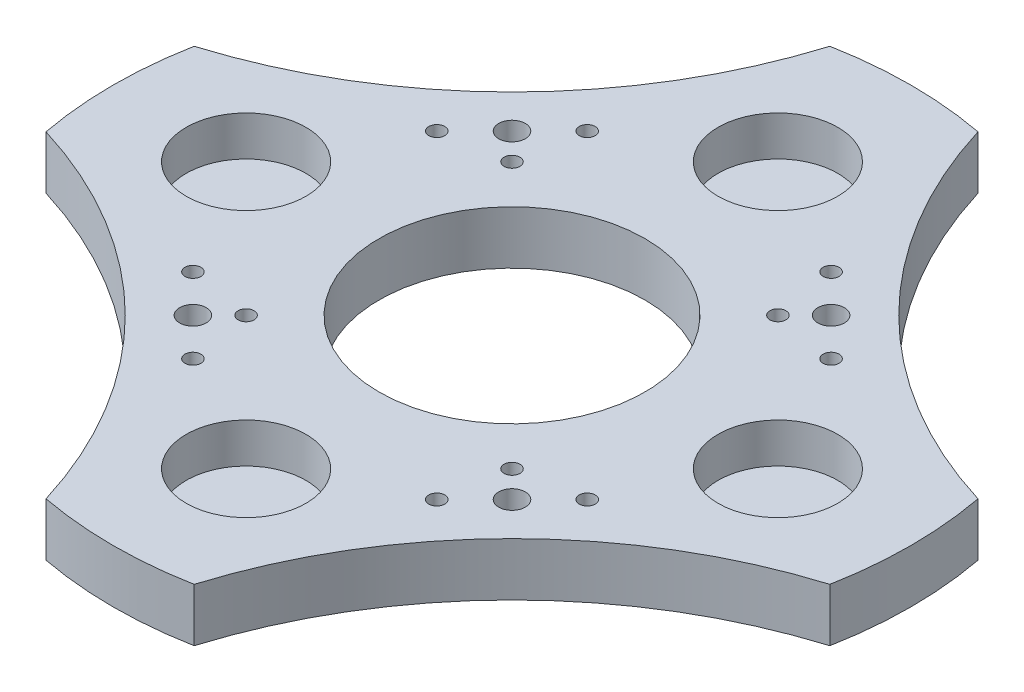
ISO-10303-21;
HEADER;
FILE_DESCRIPTION(('STEP AP214'),'2;1');
FILE_NAME('part.step','',(''),(''),'','','');
FILE_SCHEMA(('AUTOMOTIVE_DESIGN { 1 0 10303 214 1 1 1 1 }'));
ENDSEC;
DATA;
#1=APPLICATION_CONTEXT('core data for automotive mechanical design processes');
#2=APPLICATION_PROTOCOL_DEFINITION('international standard','automotive_design',2000,#1);
#3=PRODUCT_CONTEXT('',#1,'mechanical');
#4=PRODUCT('Part','Part','',(#3));
#5=PRODUCT_RELATED_PRODUCT_CATEGORY('part','',(#4));
#6=PRODUCT_DEFINITION_FORMATION('','',#4);
#7=PRODUCT_DEFINITION_CONTEXT('part definition',#1,'design');
#8=PRODUCT_DEFINITION('design','',#6,#7);
#9=PRODUCT_DEFINITION_SHAPE('','',#8);
#10=(LENGTH_UNIT() NAMED_UNIT(*) SI_UNIT(.MILLI.,.METRE.));
#11=(NAMED_UNIT(*) PLANE_ANGLE_UNIT() SI_UNIT($,.RADIAN.));
#12=(NAMED_UNIT(*) SI_UNIT($,.STERADIAN.) SOLID_ANGLE_UNIT());
#13=UNCERTAINTY_MEASURE_WITH_UNIT(LENGTH_MEASURE(1.E-05),#10,'distance_accuracy_value','');
#14=(GEOMETRIC_REPRESENTATION_CONTEXT(3) GLOBAL_UNCERTAINTY_ASSIGNED_CONTEXT((#13)) GLOBAL_UNIT_ASSIGNED_CONTEXT((#10,
#11,#12)) REPRESENTATION_CONTEXT('',''));
#15=CARTESIAN_POINT('',(0.,0.,0.));
#16=DIRECTION('',(0.,0.,1.));
#17=DIRECTION('',(1.,0.,0.));
#18=AXIS2_PLACEMENT_3D('',#15,#16,#17);
#19=CARTESIAN_POINT('',(0.,10.,0.));
#20=DIRECTION('',(0.,-1.,0.));
#21=DIRECTION('',(0.,0.,-1.));
#22=AXIS2_PLACEMENT_3D('',#19,#20,#21);
#23=CYLINDRICAL_SURFACE('',#22,75.);
#24=CARTESIAN_POINT('',(0.,0.,0.));
#25=DIRECTION('',(0.,1.,0.));
#26=DIRECTION('',(0.,0.,1.));
#27=AXIS2_PLACEMENT_3D('',#24,#25,#26);
#28=CIRCLE('',#27,75.);
#29=CARTESIAN_POINT('',(-73.6950173596536,0.,-13.9299826403464));
#30=VERTEX_POINT('',#29);
#31=CARTESIAN_POINT('',(-73.6950173596536,0.,13.9299826403464));
#32=VERTEX_POINT('',#31);
#33=EDGE_CURVE('E121',#30,#32,#28,.T.);
#34=ORIENTED_EDGE('',*,*,#33,.T.);
#35=DIRECTION('',(0.,1.,0.));
#36=VECTOR('',#35,1.);
#37=CARTESIAN_POINT('',(-73.6950173596536,5.,13.9299826403464));
#38=LINE('',#37,#36);
#39=CARTESIAN_POINT('',(-73.6950173596536,10.,13.9299826403464));
#40=VERTEX_POINT('',#39);
#41=EDGE_CURVE('E60',#32,#40,#38,.T.);
#42=ORIENTED_EDGE('',*,*,#41,.T.);
#43=CARTESIAN_POINT('',(0.,10.,0.));
#44=DIRECTION('',(0.,1.,0.));
#45=DIRECTION('',(0.,0.,1.));
#46=AXIS2_PLACEMENT_3D('',#43,#44,#45);
#47=CIRCLE('',#46,75.);
#48=CARTESIAN_POINT('',(-73.6950173596536,10.,-13.9299826403464));
#49=VERTEX_POINT('',#48);
#50=EDGE_CURVE('E123',#49,#40,#47,.T.);
#51=ORIENTED_EDGE('',*,*,#50,.F.);
#52=DIRECTION('',(0.,1.,0.));
#53=VECTOR('',#52,1.);
#54=CARTESIAN_POINT('',(-73.6950173596536,5.,-13.9299826403464));
#55=LINE('',#54,#53);
#56=EDGE_CURVE('E110',#49,#30,#55,.F.);
#57=ORIENTED_EDGE('',*,*,#56,.T.);
#58=EDGE_LOOP('',(#34,#42,#51,#57));
#59=FACE_BOUND('',#58,.T.);
#60=ADVANCED_FACE('F43',(#59),#23,.T.);
#61=CARTESIAN_POINT('',(-13.9299826403464,10.,73.6950173596536));
#62=VERTEX_POINT('',#61);
#63=CARTESIAN_POINT('',(13.9299826403463,10.,73.6950173596536));
#64=VERTEX_POINT('',#63);
#65=EDGE_CURVE('E53',#62,#64,#47,.T.);
#66=ORIENTED_EDGE('',*,*,#65,.F.);
#67=DIRECTION('',(0.,1.,0.));
#68=VECTOR('',#67,1.);
#69=CARTESIAN_POINT('',(-13.9299826403464,5.,73.6950173596536));
#70=LINE('',#69,#68);
#71=CARTESIAN_POINT('',(-13.9299826403464,0.,73.6950173596536));
#72=VERTEX_POINT('',#71);
#73=EDGE_CURVE('E134',#62,#72,#70,.F.);
#74=ORIENTED_EDGE('',*,*,#73,.T.);
#75=CARTESIAN_POINT('',(13.9299826403463,0.,73.6950173596536));
#76=VERTEX_POINT('',#75);
#77=EDGE_CURVE('E47',#72,#76,#28,.T.);
#78=ORIENTED_EDGE('',*,*,#77,.T.);
#79=DIRECTION('',(0.,1.,0.));
#80=VECTOR('',#79,1.);
#81=CARTESIAN_POINT('',(13.9299826403463,5.,73.6950173596536));
#82=LINE('',#81,#80);
#83=EDGE_CURVE('E148',#76,#64,#82,.T.);
#84=ORIENTED_EDGE('',*,*,#83,.T.);
#85=EDGE_LOOP('',(#66,#74,#78,#84));
#86=FACE_BOUND('',#85,.T.);
#87=ADVANCED_FACE('F351',(#86),#23,.T.);
#88=CARTESIAN_POINT('',(73.6950173596536,10.,13.9299826403463));
#89=VERTEX_POINT('',#88);
#90=CARTESIAN_POINT('',(73.6950173596536,10.,-13.9299826403464));
#91=VERTEX_POINT('',#90);
#92=EDGE_CURVE('E11',#89,#91,#47,.T.);
#93=ORIENTED_EDGE('',*,*,#92,.F.);
#94=DIRECTION('',(0.,1.,0.));
#95=VECTOR('',#94,1.);
#96=CARTESIAN_POINT('',(73.6950173596536,5.,13.9299826403463));
#97=LINE('',#96,#95);
#98=CARTESIAN_POINT('',(73.6950173596536,0.,13.9299826403463));
#99=VERTEX_POINT('',#98);
#100=EDGE_CURVE('E150',#89,#99,#97,.F.);
#101=ORIENTED_EDGE('',*,*,#100,.T.);
#102=CARTESIAN_POINT('',(73.6950173596536,0.,-13.9299826403464));
#103=VERTEX_POINT('',#102);
#104=EDGE_CURVE('E129',#99,#103,#28,.T.);
#105=ORIENTED_EDGE('',*,*,#104,.T.);
#106=DIRECTION('',(0.,1.,0.));
#107=VECTOR('',#106,1.);
#108=CARTESIAN_POINT('',(73.6950173596536,5.,-13.9299826403464));
#109=LINE('',#108,#107);
#110=EDGE_CURVE('E152',#103,#91,#109,.T.);
#111=ORIENTED_EDGE('',*,*,#110,.T.);
#112=EDGE_LOOP('',(#93,#101,#105,#111));
#113=FACE_BOUND('',#112,.T.);
#114=ADVANCED_FACE('F361',(#113),#23,.T.);
#115=CARTESIAN_POINT('',(13.9299826403464,10.,-73.6950173596536));
#116=VERTEX_POINT('',#115);
#117=CARTESIAN_POINT('',(-13.9299826403464,10.,-73.6950173596536));
#118=VERTEX_POINT('',#117);
#119=EDGE_CURVE('E52',#116,#118,#47,.T.);
#120=ORIENTED_EDGE('',*,*,#119,.F.);
#121=DIRECTION('',(0.,1.,0.));
#122=VECTOR('',#121,1.);
#123=CARTESIAN_POINT('',(13.9299826403463,5.,-73.6950173596536));
#124=LINE('',#123,#122);
#125=CARTESIAN_POINT('',(13.9299826403464,0.,-73.6950173596536));
#126=VERTEX_POINT('',#125);
#127=EDGE_CURVE('E154',#116,#126,#124,.F.);
#128=ORIENTED_EDGE('',*,*,#127,.T.);
#129=CARTESIAN_POINT('',(-13.9299826403464,0.,-73.6950173596536));
#130=VERTEX_POINT('',#129);
#131=EDGE_CURVE('E128',#126,#130,#28,.T.);
#132=ORIENTED_EDGE('',*,*,#131,.T.);
#133=DIRECTION('',(0.,1.,0.));
#134=VECTOR('',#133,1.);
#135=CARTESIAN_POINT('',(-13.9299826403464,5.,-73.6950173596536));
#136=LINE('',#135,#134);
#137=EDGE_CURVE('E68',#130,#118,#136,.T.);
#138=ORIENTED_EDGE('',*,*,#137,.T.);
#139=EDGE_LOOP('',(#120,#128,#132,#138));
#140=FACE_BOUND('',#139,.T.);
#141=ADVANCED_FACE('F45',(#140),#23,.T.);
#142=CARTESIAN_POINT('',(0.,10.,0.));
#143=DIRECTION('',(0.,1.,0.));
#144=DIRECTION('',(0.,0.,1.));
#145=AXIS2_PLACEMENT_3D('',#142,#143,#144);
#146=PLANE('',#145);
#147=CARTESIAN_POINT('',(-50.,10.,0.));
#148=DIRECTION('',(0.,1.,0.));
#149=DIRECTION('',(0.,0.,1.));
#150=AXIS2_PLACEMENT_3D('',#147,#148,#149);
#151=CIRCLE('',#150,11.25);
#152=CARTESIAN_POINT('',(-50.,10.,11.25));
#153=VERTEX_POINT('',#152);
#154=EDGE_CURVE('E293',#153,#153,#151,.T.);
#155=ORIENTED_EDGE('',*,*,#154,.F.);
#156=EDGE_LOOP('',(#155));
#157=FACE_BOUND('',#156,.T.);
#158=CARTESIAN_POINT('',(0.,10.,-50.));
#159=DIRECTION('',(0.,1.,0.));
#160=DIRECTION('',(0.,0.,1.));
#161=AXIS2_PLACEMENT_3D('',#158,#159,#160);
#162=CIRCLE('',#161,11.25);
#163=CARTESIAN_POINT('',(0.,10.,-38.75));
#164=VERTEX_POINT('',#163);
#165=EDGE_CURVE('E290',#164,#164,#162,.T.);
#166=ORIENTED_EDGE('',*,*,#165,.F.);
#167=EDGE_LOOP('',(#166));
#168=FACE_BOUND('',#167,.T.);
#169=CARTESIAN_POINT('',(50.,10.,0.));
#170=DIRECTION('',(0.,1.,0.));
#171=DIRECTION('',(0.,0.,1.));
#172=AXIS2_PLACEMENT_3D('',#169,#170,#171);
#173=CIRCLE('',#172,11.25);
#174=CARTESIAN_POINT('',(50.,10.,11.25));
#175=VERTEX_POINT('',#174);
#176=EDGE_CURVE('E284',#175,#175,#173,.T.);
#177=ORIENTED_EDGE('',*,*,#176,.F.);
#178=EDGE_LOOP('',(#177));
#179=FACE_BOUND('',#178,.T.);
#180=CARTESIAN_POINT('',(0.,10.,50.));
#181=DIRECTION('',(0.,1.,0.));
#182=DIRECTION('',(0.,0.,1.));
#183=AXIS2_PLACEMENT_3D('',#180,#181,#182);
#184=CIRCLE('',#183,11.25);
#185=CARTESIAN_POINT('',(0.,10.,61.25));
#186=VERTEX_POINT('',#185);
#187=EDGE_CURVE('E278',#186,#186,#184,.T.);
#188=ORIENTED_EDGE('',*,*,#187,.F.);
#189=EDGE_LOOP('',(#188));
#190=FACE_BOUND('',#189,.T.);
#191=CARTESIAN_POINT('',(-25.,10.,25.));
#192=DIRECTION('',(0.,1.,0.));
#193=DIRECTION('',(0.,0.,1.));
#194=AXIS2_PLACEMENT_3D('',#191,#192,#193);
#195=CIRCLE('',#194,1.5);
#196=CARTESIAN_POINT('',(-25.,10.,26.5));
#197=VERTEX_POINT('',#196);
#198=EDGE_CURVE('E260',#197,#197,#195,.T.);
#199=ORIENTED_EDGE('',*,*,#198,.F.);
#200=EDGE_LOOP('',(#199));
#201=FACE_BOUND('',#200,.T.);
#202=CARTESIAN_POINT('',(25.,10.,25.));
#203=DIRECTION('',(0.,1.,0.));
#204=DIRECTION('',(0.,0.,1.));
#205=AXIS2_PLACEMENT_3D('',#202,#203,#204);
#206=CIRCLE('',#205,1.5);
#207=CARTESIAN_POINT('',(25.,10.,26.5));
#208=VERTEX_POINT('',#207);
#209=EDGE_CURVE('E267',#208,#208,#206,.T.);
#210=ORIENTED_EDGE('',*,*,#209,.F.);
#211=EDGE_LOOP('',(#210));
#212=FACE_BOUND('',#211,.T.);
#213=CARTESIAN_POINT('',(25.,10.,-25.));
#214=DIRECTION('',(0.,1.,0.));
#215=DIRECTION('',(0.,0.,1.));
#216=AXIS2_PLACEMENT_3D('',#213,#214,#215);
#217=CIRCLE('',#216,1.5);
#218=CARTESIAN_POINT('',(25.,10.,-23.5));
#219=VERTEX_POINT('',#218);
#220=EDGE_CURVE('E254',#219,#219,#217,.T.);
#221=ORIENTED_EDGE('',*,*,#220,.F.);
#222=EDGE_LOOP('',(#221));
#223=FACE_BOUND('',#222,.T.);
#224=CARTESIAN_POINT('',(-25.,10.,-25.));
#225=DIRECTION('',(0.,1.,0.));
#226=DIRECTION('',(0.,0.,1.));
#227=AXIS2_PLACEMENT_3D('',#224,#225,#226);
#228=CIRCLE('',#227,1.5);
#229=CARTESIAN_POINT('',(-25.,10.,-23.5));
#230=VERTEX_POINT('',#229);
#231=EDGE_CURVE('E251',#230,#230,#228,.T.);
#232=ORIENTED_EDGE('',*,*,#231,.F.);
#233=EDGE_LOOP('',(#232));
#234=FACE_BOUND('',#233,.T.);
#235=CARTESIAN_POINT('',(37.0710678118654,10.,22.9289321881345));
#236=DIRECTION('',(0.,1.,0.));
#237=DIRECTION('',(0.,0.,1.));
#238=AXIS2_PLACEMENT_3D('',#235,#236,#237);
#239=CIRCLE('',#238,1.5);
#240=CARTESIAN_POINT('',(37.0710678118654,10.,24.4289321881345));
#241=VERTEX_POINT('',#240);
#242=EDGE_CURVE('E206',#241,#241,#239,.T.);
#243=ORIENTED_EDGE('',*,*,#242,.F.);
#244=EDGE_LOOP('',(#243));
#245=FACE_BOUND('',#244,.T.);
#246=CARTESIAN_POINT('',(22.9289321881346,10.,37.0710678118655));
#247=DIRECTION('',(0.,1.,0.));
#248=DIRECTION('',(0.,0.,1.));
#249=AXIS2_PLACEMENT_3D('',#246,#247,#248);
#250=CIRCLE('',#249,1.5);
#251=CARTESIAN_POINT('',(22.9289321881346,10.,38.5710678118655));
#252=VERTEX_POINT('',#251);
#253=EDGE_CURVE('E213',#252,#252,#250,.T.);
#254=ORIENTED_EDGE('',*,*,#253,.F.);
#255=EDGE_LOOP('',(#254));
#256=FACE_BOUND('',#255,.T.);
#257=CARTESIAN_POINT('',(-22.9289321881345,10.,37.0710678118655));
#258=DIRECTION('',(0.,1.,0.));
#259=DIRECTION('',(0.,0.,1.));
#260=AXIS2_PLACEMENT_3D('',#257,#258,#259);
#261=CIRCLE('',#260,1.5);
#262=CARTESIAN_POINT('',(-22.9289321881345,10.,38.5710678118655));
#263=VERTEX_POINT('',#262);
#264=EDGE_CURVE('E219',#263,#263,#261,.T.);
#265=ORIENTED_EDGE('',*,*,#264,.F.);
#266=EDGE_LOOP('',(#265));
#267=FACE_BOUND('',#266,.T.);
#268=CARTESIAN_POINT('',(-37.0710678118655,10.,22.9289321881345));
#269=DIRECTION('',(0.,1.,0.));
#270=DIRECTION('',(0.,0.,1.));
#271=AXIS2_PLACEMENT_3D('',#268,#269,#270);
#272=CIRCLE('',#271,1.5);
#273=CARTESIAN_POINT('',(-37.0710678118655,10.,24.4289321881345));
#274=VERTEX_POINT('',#273);
#275=EDGE_CURVE('E183',#274,#274,#272,.T.);
#276=ORIENTED_EDGE('',*,*,#275,.F.);
#277=EDGE_LOOP('',(#276));
#278=FACE_BOUND('',#277,.T.);
#279=CARTESIAN_POINT('',(0.,10.,0.));
#280=DIRECTION('',(0.,1.,0.));
#281=DIRECTION('',(0.,0.,1.));
#282=AXIS2_PLACEMENT_3D('',#279,#280,#281);
#283=CIRCLE('',#282,25.);
#284=CARTESIAN_POINT('',(0.,10.,25.));
#285=VERTEX_POINT('',#284);
#286=EDGE_CURVE('E182',#285,#285,#283,.T.);
#287=ORIENTED_EDGE('',*,*,#286,.F.);
#288=EDGE_LOOP('',(#287));
#289=FACE_BOUND('',#288,.T.);
#290=CARTESIAN_POINT('',(-30.,10.,30.));
#291=DIRECTION('',(0.,1.,0.));
#292=DIRECTION('',(0.,0.,1.));
#293=AXIS2_PLACEMENT_3D('',#290,#291,#292);
#294=CIRCLE('',#293,2.5);
#295=CARTESIAN_POINT('',(-30.,10.,32.5));
#296=VERTEX_POINT('',#295);
#297=EDGE_CURVE('E189',#296,#296,#294,.T.);
#298=ORIENTED_EDGE('',*,*,#297,.F.);
#299=EDGE_LOOP('',(#298));
#300=FACE_BOUND('',#299,.T.);
#301=CARTESIAN_POINT('',(30.,10.,30.));
#302=DIRECTION('',(0.,1.,0.));
#303=DIRECTION('',(0.,0.,1.));
#304=AXIS2_PLACEMENT_3D('',#301,#302,#303);
#305=CIRCLE('',#304,2.5);
#306=CARTESIAN_POINT('',(30.,10.,32.5));
#307=VERTEX_POINT('',#306);
#308=EDGE_CURVE('E195',#307,#307,#305,.T.);
#309=ORIENTED_EDGE('',*,*,#308,.F.);
#310=EDGE_LOOP('',(#309));
#311=FACE_BOUND('',#310,.T.);
#312=CARTESIAN_POINT('',(30.,10.,-30.));
#313=DIRECTION('',(0.,1.,0.));
#314=DIRECTION('',(0.,0.,1.));
#315=AXIS2_PLACEMENT_3D('',#312,#313,#314);
#316=CIRCLE('',#315,2.5);
#317=CARTESIAN_POINT('',(30.,10.,-27.5));
#318=VERTEX_POINT('',#317);
#319=EDGE_CURVE('E176',#318,#318,#316,.T.);
#320=ORIENTED_EDGE('',*,*,#319,.F.);
#321=EDGE_LOOP('',(#320));
#322=FACE_BOUND('',#321,.T.);
#323=CARTESIAN_POINT('',(37.0710678118655,10.,-22.9289321881346));
#324=DIRECTION('',(0.,1.,0.));
#325=DIRECTION('',(0.,0.,1.));
#326=AXIS2_PLACEMENT_3D('',#323,#324,#325);
#327=CIRCLE('',#326,1.5);
#328=CARTESIAN_POINT('',(37.0710678118655,10.,-21.4289321881346));
#329=VERTEX_POINT('',#328);
#330=EDGE_CURVE('E207',#329,#329,#327,.T.);
#331=ORIENTED_EDGE('',*,*,#330,.F.);
#332=EDGE_LOOP('',(#331));
#333=FACE_BOUND('',#332,.T.);
#334=CARTESIAN_POINT('',(22.9289321881345,10.,-37.0710678118654));
#335=DIRECTION('',(0.,1.,0.));
#336=DIRECTION('',(0.,0.,1.));
#337=AXIS2_PLACEMENT_3D('',#334,#335,#336);
#338=CIRCLE('',#337,1.5);
#339=CARTESIAN_POINT('',(22.9289321881345,10.,-35.5710678118654));
#340=VERTEX_POINT('',#339);
#341=EDGE_CURVE('E243',#340,#340,#338,.T.);
#342=ORIENTED_EDGE('',*,*,#341,.F.);
#343=EDGE_LOOP('',(#342));
#344=FACE_BOUND('',#343,.T.);
#345=CARTESIAN_POINT('',(-22.9289321881345,10.,-37.0710678118655));
#346=DIRECTION('',(0.,1.,0.));
#347=DIRECTION('',(0.,0.,1.));
#348=AXIS2_PLACEMENT_3D('',#345,#346,#347);
#349=CIRCLE('',#348,1.5);
#350=CARTESIAN_POINT('',(-22.9289321881345,10.,-35.5710678118655));
#351=VERTEX_POINT('',#350);
#352=EDGE_CURVE('E237',#351,#351,#349,.T.);
#353=ORIENTED_EDGE('',*,*,#352,.F.);
#354=EDGE_LOOP('',(#353));
#355=FACE_BOUND('',#354,.T.);
#356=CARTESIAN_POINT('',(-37.0710678118655,10.,-22.9289321881345));
#357=DIRECTION('',(0.,1.,0.));
#358=DIRECTION('',(0.,0.,1.));
#359=AXIS2_PLACEMENT_3D('',#356,#357,#358);
#360=CIRCLE('',#359,1.5);
#361=CARTESIAN_POINT('',(-37.0710678118655,10.,-21.4289321881345));
#362=VERTEX_POINT('',#361);
#363=EDGE_CURVE('E230',#362,#362,#360,.T.);
#364=ORIENTED_EDGE('',*,*,#363,.F.);
#365=EDGE_LOOP('',(#364));
#366=FACE_BOUND('',#365,.T.);
#367=CARTESIAN_POINT('',(-30.,10.,-30.));
#368=DIRECTION('',(0.,1.,0.));
#369=DIRECTION('',(0.,0.,1.));
#370=AXIS2_PLACEMENT_3D('',#367,#368,#369);
#371=CIRCLE('',#370,2.5);
#372=CARTESIAN_POINT('',(-30.,10.,-27.5));
#373=VERTEX_POINT('',#372);
#374=EDGE_CURVE('E173',#373,#373,#371,.T.);
#375=ORIENTED_EDGE('',*,*,#374,.F.);
#376=EDGE_LOOP('',(#375));
#377=FACE_BOUND('',#376,.T.);
#378=CARTESIAN_POINT('',(-100.,10.,100.));
#379=DIRECTION('',(0.,1.,0.));
#380=DIRECTION('',(0.,0.,1.));
#381=AXIS2_PLACEMENT_3D('',#378,#379,#380);
#382=CIRCLE('',#381,90.);
#383=EDGE_CURVE('E161',#62,#40,#382,.T.);
#384=ORIENTED_EDGE('',*,*,#383,.F.);
#385=ORIENTED_EDGE('',*,*,#65,.T.);
#386=CARTESIAN_POINT('',(100.,10.,100.));
#387=DIRECTION('',(0.,1.,0.));
#388=DIRECTION('',(0.,0.,1.));
#389=AXIS2_PLACEMENT_3D('',#386,#387,#388);
#390=CIRCLE('',#389,90.);
#391=EDGE_CURVE('E167',#89,#64,#390,.T.);
#392=ORIENTED_EDGE('',*,*,#391,.F.);
#393=ORIENTED_EDGE('',*,*,#92,.T.);
#394=CARTESIAN_POINT('',(100.,10.,-100.));
#395=DIRECTION('',(0.,1.,0.));
#396=DIRECTION('',(0.,0.,1.));
#397=AXIS2_PLACEMENT_3D('',#394,#395,#396);
#398=CIRCLE('',#397,90.);
#399=EDGE_CURVE('E158',#116,#91,#398,.T.);
#400=ORIENTED_EDGE('',*,*,#399,.F.);
#401=ORIENTED_EDGE('',*,*,#119,.T.);
#402=CARTESIAN_POINT('',(-100.,10.,-100.));
#403=DIRECTION('',(0.,1.,0.));
#404=DIRECTION('',(0.,0.,1.));
#405=AXIS2_PLACEMENT_3D('',#402,#403,#404);
#406=CIRCLE('',#405,90.);
#407=EDGE_CURVE('E116',#49,#118,#406,.T.);
#408=ORIENTED_EDGE('',*,*,#407,.F.);
#409=ORIENTED_EDGE('',*,*,#50,.T.);
#410=EDGE_LOOP('',(#384,#385,#392,#393,#400,#401,#408,#409));
#411=FACE_BOUND('',#410,.T.);
#412=ADVANCED_FACE('F308',(#157,#168,#179,#190,#201,#212,#223,#234,#245,#256,#267,#278,#289,
#300,#311,#322,#333,#344,#355,#366,#377,#411),#146,.T.);
#413=CARTESIAN_POINT('',(0.,0.,0.));
#414=DIRECTION('',(0.,1.,0.));
#415=DIRECTION('',(0.,0.,1.));
#416=AXIS2_PLACEMENT_3D('',#413,#414,#415);
#417=PLANE('',#416);
#418=CARTESIAN_POINT('',(-25.,0.,25.));
#419=DIRECTION('',(0.,1.,0.));
#420=DIRECTION('',(0.,0.,1.));
#421=AXIS2_PLACEMENT_3D('',#418,#419,#420);
#422=CIRCLE('',#421,1.5);
#423=CARTESIAN_POINT('',(-25.,0.,26.5));
#424=VERTEX_POINT('',#423);
#425=EDGE_CURVE('E257',#424,#424,#422,.T.);
#426=ORIENTED_EDGE('',*,*,#425,.T.);
#427=EDGE_LOOP('',(#426));
#428=FACE_BOUND('',#427,.T.);
#429=CARTESIAN_POINT('',(25.,0.,25.));
#430=DIRECTION('',(0.,1.,0.));
#431=DIRECTION('',(0.,0.,1.));
#432=AXIS2_PLACEMENT_3D('',#429,#430,#431);
#433=CIRCLE('',#432,1.5);
#434=CARTESIAN_POINT('',(25.,0.,26.5));
#435=VERTEX_POINT('',#434);
#436=EDGE_CURVE('E264',#435,#435,#433,.T.);
#437=ORIENTED_EDGE('',*,*,#436,.T.);
#438=EDGE_LOOP('',(#437));
#439=FACE_BOUND('',#438,.T.);
#440=CARTESIAN_POINT('',(25.,0.,-25.));
#441=DIRECTION('',(0.,1.,0.));
#442=DIRECTION('',(0.,0.,1.));
#443=AXIS2_PLACEMENT_3D('',#440,#441,#442);
#444=CIRCLE('',#443,1.5);
#445=CARTESIAN_POINT('',(25.,0.,-23.5));
#446=VERTEX_POINT('',#445);
#447=EDGE_CURVE('E270',#446,#446,#444,.T.);
#448=ORIENTED_EDGE('',*,*,#447,.T.);
#449=EDGE_LOOP('',(#448));
#450=FACE_BOUND('',#449,.T.);
#451=CARTESIAN_POINT('',(-25.,0.,-25.));
#452=DIRECTION('',(0.,1.,0.));
#453=DIRECTION('',(0.,0.,1.));
#454=AXIS2_PLACEMENT_3D('',#451,#452,#453);
#455=CIRCLE('',#454,1.5);
#456=CARTESIAN_POINT('',(-25.,0.,-23.5));
#457=VERTEX_POINT('',#456);
#458=EDGE_CURVE('E231',#457,#457,#455,.T.);
#459=ORIENTED_EDGE('',*,*,#458,.T.);
#460=EDGE_LOOP('',(#459));
#461=FACE_BOUND('',#460,.T.);
#462=CARTESIAN_POINT('',(37.0710678118654,0.,22.9289321881345));
#463=DIRECTION('',(0.,1.,0.));
#464=DIRECTION('',(0.,0.,1.));
#465=AXIS2_PLACEMENT_3D('',#462,#463,#464);
#466=CIRCLE('',#465,1.5);
#467=CARTESIAN_POINT('',(37.0710678118654,0.,24.4289321881345));
#468=VERTEX_POINT('',#467);
#469=EDGE_CURVE('E203',#468,#468,#466,.T.);
#470=ORIENTED_EDGE('',*,*,#469,.T.);
#471=EDGE_LOOP('',(#470));
#472=FACE_BOUND('',#471,.T.);
#473=CARTESIAN_POINT('',(22.9289321881346,0.,37.0710678118655));
#474=DIRECTION('',(0.,1.,0.));
#475=DIRECTION('',(0.,0.,1.));
#476=AXIS2_PLACEMENT_3D('',#473,#474,#475);
#477=CIRCLE('',#476,1.5);
#478=CARTESIAN_POINT('',(22.9289321881346,0.,38.5710678118655));
#479=VERTEX_POINT('',#478);
#480=EDGE_CURVE('E210',#479,#479,#477,.T.);
#481=ORIENTED_EDGE('',*,*,#480,.T.);
#482=EDGE_LOOP('',(#481));
#483=FACE_BOUND('',#482,.T.);
#484=CARTESIAN_POINT('',(-22.9289321881345,0.,37.0710678118655));
#485=DIRECTION('',(0.,1.,0.));
#486=DIRECTION('',(0.,0.,1.));
#487=AXIS2_PLACEMENT_3D('',#484,#485,#486);
#488=CIRCLE('',#487,1.5);
#489=CARTESIAN_POINT('',(-22.9289321881345,0.,38.5710678118655));
#490=VERTEX_POINT('',#489);
#491=EDGE_CURVE('E216',#490,#490,#488,.T.);
#492=ORIENTED_EDGE('',*,*,#491,.T.);
#493=EDGE_LOOP('',(#492));
#494=FACE_BOUND('',#493,.T.);
#495=CARTESIAN_POINT('',(-37.0710678118655,0.,22.9289321881345));
#496=DIRECTION('',(0.,1.,0.));
#497=DIRECTION('',(0.,0.,1.));
#498=AXIS2_PLACEMENT_3D('',#495,#496,#497);
#499=CIRCLE('',#498,1.5);
#500=CARTESIAN_POINT('',(-37.0710678118655,0.,24.4289321881345));
#501=VERTEX_POINT('',#500);
#502=EDGE_CURVE('E222',#501,#501,#499,.T.);
#503=ORIENTED_EDGE('',*,*,#502,.T.);
#504=EDGE_LOOP('',(#503));
#505=FACE_BOUND('',#504,.T.);
#506=CARTESIAN_POINT('',(0.,0.,0.));
#507=DIRECTION('',(0.,1.,0.));
#508=DIRECTION('',(0.,0.,1.));
#509=AXIS2_PLACEMENT_3D('',#506,#507,#508);
#510=CIRCLE('',#509,25.);
#511=CARTESIAN_POINT('',(0.,0.,25.));
#512=VERTEX_POINT('',#511);
#513=EDGE_CURVE('E179',#512,#512,#510,.T.);
#514=ORIENTED_EDGE('',*,*,#513,.T.);
#515=EDGE_LOOP('',(#514));
#516=FACE_BOUND('',#515,.T.);
#517=CARTESIAN_POINT('',(-30.,0.,30.));
#518=DIRECTION('',(0.,1.,0.));
#519=DIRECTION('',(0.,0.,1.));
#520=AXIS2_PLACEMENT_3D('',#517,#518,#519);
#521=CIRCLE('',#520,2.5);
#522=CARTESIAN_POINT('',(-30.,0.,32.5));
#523=VERTEX_POINT('',#522);
#524=EDGE_CURVE('E186',#523,#523,#521,.T.);
#525=ORIENTED_EDGE('',*,*,#524,.T.);
#526=EDGE_LOOP('',(#525));
#527=FACE_BOUND('',#526,.T.);
#528=CARTESIAN_POINT('',(30.,0.,30.));
#529=DIRECTION('',(0.,1.,0.));
#530=DIRECTION('',(0.,0.,1.));
#531=AXIS2_PLACEMENT_3D('',#528,#529,#530);
#532=CIRCLE('',#531,2.5);
#533=CARTESIAN_POINT('',(30.,0.,32.5));
#534=VERTEX_POINT('',#533);
#535=EDGE_CURVE('E192',#534,#534,#532,.T.);
#536=ORIENTED_EDGE('',*,*,#535,.T.);
#537=EDGE_LOOP('',(#536));
#538=FACE_BOUND('',#537,.T.);
#539=CARTESIAN_POINT('',(30.,0.,-30.));
#540=DIRECTION('',(0.,1.,0.));
#541=DIRECTION('',(0.,0.,1.));
#542=AXIS2_PLACEMENT_3D('',#539,#540,#541);
#543=CIRCLE('',#542,2.5);
#544=CARTESIAN_POINT('',(30.,0.,-27.5));
#545=VERTEX_POINT('',#544);
#546=EDGE_CURVE('E198',#545,#545,#543,.T.);
#547=ORIENTED_EDGE('',*,*,#546,.T.);
#548=EDGE_LOOP('',(#547));
#549=FACE_BOUND('',#548,.T.);
#550=CARTESIAN_POINT('',(37.0710678118655,0.,-22.9289321881346));
#551=DIRECTION('',(0.,1.,0.));
#552=DIRECTION('',(0.,0.,1.));
#553=AXIS2_PLACEMENT_3D('',#550,#551,#552);
#554=CIRCLE('',#553,1.5);
#555=CARTESIAN_POINT('',(37.0710678118655,0.,-21.4289321881346));
#556=VERTEX_POINT('',#555);
#557=EDGE_CURVE('E246',#556,#556,#554,.T.);
#558=ORIENTED_EDGE('',*,*,#557,.T.);
#559=EDGE_LOOP('',(#558));
#560=FACE_BOUND('',#559,.T.);
#561=CARTESIAN_POINT('',(22.9289321881345,0.,-37.0710678118654));
#562=DIRECTION('',(0.,1.,0.));
#563=DIRECTION('',(0.,0.,1.));
#564=AXIS2_PLACEMENT_3D('',#561,#562,#563);
#565=CIRCLE('',#564,1.5);
#566=CARTESIAN_POINT('',(22.9289321881345,0.,-35.5710678118654));
#567=VERTEX_POINT('',#566);
#568=EDGE_CURVE('E240',#567,#567,#565,.T.);
#569=ORIENTED_EDGE('',*,*,#568,.T.);
#570=EDGE_LOOP('',(#569));
#571=FACE_BOUND('',#570,.T.);
#572=CARTESIAN_POINT('',(-22.9289321881345,0.,-37.0710678118655));
#573=DIRECTION('',(0.,1.,0.));
#574=DIRECTION('',(0.,0.,1.));
#575=AXIS2_PLACEMENT_3D('',#572,#573,#574);
#576=CIRCLE('',#575,1.5);
#577=CARTESIAN_POINT('',(-22.9289321881345,0.,-35.5710678118655));
#578=VERTEX_POINT('',#577);
#579=EDGE_CURVE('E234',#578,#578,#576,.T.);
#580=ORIENTED_EDGE('',*,*,#579,.T.);
#581=EDGE_LOOP('',(#580));
#582=FACE_BOUND('',#581,.T.);
#583=CARTESIAN_POINT('',(-37.0710678118655,0.,-22.9289321881345));
#584=DIRECTION('',(0.,1.,0.));
#585=DIRECTION('',(0.,0.,1.));
#586=AXIS2_PLACEMENT_3D('',#583,#584,#585);
#587=CIRCLE('',#586,1.5);
#588=CARTESIAN_POINT('',(-37.0710678118655,0.,-21.4289321881345));
#589=VERTEX_POINT('',#588);
#590=EDGE_CURVE('E227',#589,#589,#587,.T.);
#591=ORIENTED_EDGE('',*,*,#590,.T.);
#592=EDGE_LOOP('',(#591));
#593=FACE_BOUND('',#592,.T.);
#594=CARTESIAN_POINT('',(-30.,0.,-30.));
#595=DIRECTION('',(0.,1.,0.));
#596=DIRECTION('',(0.,0.,1.));
#597=AXIS2_PLACEMENT_3D('',#594,#595,#596);
#598=CIRCLE('',#597,2.5);
#599=CARTESIAN_POINT('',(-30.,0.,-27.5));
#600=VERTEX_POINT('',#599);
#601=EDGE_CURVE('E162',#600,#600,#598,.T.);
#602=ORIENTED_EDGE('',*,*,#601,.T.);
#603=EDGE_LOOP('',(#602));
#604=FACE_BOUND('',#603,.T.);
#605=ORIENTED_EDGE('',*,*,#77,.F.);
#606=CARTESIAN_POINT('',(-100.,0.,100.));
#607=DIRECTION('',(0.,1.,0.));
#608=DIRECTION('',(0.,0.,1.));
#609=AXIS2_PLACEMENT_3D('',#606,#607,#608);
#610=CIRCLE('',#609,90.);
#611=EDGE_CURVE('E127',#72,#32,#610,.T.);
#612=ORIENTED_EDGE('',*,*,#611,.T.);
#613=ORIENTED_EDGE('',*,*,#33,.F.);
#614=CARTESIAN_POINT('',(-100.,0.,-100.));
#615=DIRECTION('',(0.,1.,0.));
#616=DIRECTION('',(0.,0.,1.));
#617=AXIS2_PLACEMENT_3D('',#614,#615,#616);
#618=CIRCLE('',#617,90.);
#619=EDGE_CURVE('E107',#30,#130,#618,.T.);
#620=ORIENTED_EDGE('',*,*,#619,.T.);
#621=ORIENTED_EDGE('',*,*,#131,.F.);
#622=CARTESIAN_POINT('',(100.,0.,-100.));
#623=DIRECTION('',(0.,1.,0.));
#624=DIRECTION('',(0.,0.,1.));
#625=AXIS2_PLACEMENT_3D('',#622,#623,#624);
#626=CIRCLE('',#625,90.);
#627=EDGE_CURVE('E169',#126,#103,#626,.T.);
#628=ORIENTED_EDGE('',*,*,#627,.T.);
#629=ORIENTED_EDGE('',*,*,#104,.F.);
#630=CARTESIAN_POINT('',(100.,0.,100.));
#631=DIRECTION('',(0.,1.,0.));
#632=DIRECTION('',(0.,0.,1.));
#633=AXIS2_PLACEMENT_3D('',#630,#631,#632);
#634=CIRCLE('',#633,90.);
#635=EDGE_CURVE('E164',#99,#76,#634,.T.);
#636=ORIENTED_EDGE('',*,*,#635,.T.);
#637=EDGE_LOOP('',(#605,#612,#613,#620,#621,#628,#629,#636));
#638=FACE_BOUND('',#637,.T.);
#639=ADVANCED_FACE('F126',(#428,#439,#450,#461,#472,#483,#494,#505,#516,#527,#538,#549,#560,
#571,#582,#593,#604,#638),#417,.F.);
#640=CARTESIAN_POINT('',(-100.,0.,-100.));
#641=DIRECTION('',(0.,1.,0.));
#642=DIRECTION('',(0.,0.,1.));
#643=AXIS2_PLACEMENT_3D('',#640,#641,#642);
#644=CYLINDRICAL_SURFACE('',#643,90.);
#645=ORIENTED_EDGE('',*,*,#619,.F.);
#646=ORIENTED_EDGE('',*,*,#56,.F.);
#647=ORIENTED_EDGE('',*,*,#407,.T.);
#648=ORIENTED_EDGE('',*,*,#137,.F.);
#649=EDGE_LOOP('',(#645,#646,#647,#648));
#650=FACE_BOUND('',#649,.T.);
#651=ADVANCED_FACE('F109',(#650),#644,.F.);
#652=CARTESIAN_POINT('',(100.,0.,-100.));
#653=DIRECTION('',(0.,1.,0.));
#654=DIRECTION('',(0.,0.,1.));
#655=AXIS2_PLACEMENT_3D('',#652,#653,#654);
#656=CYLINDRICAL_SURFACE('',#655,90.);
#657=ORIENTED_EDGE('',*,*,#627,.F.);
#658=ORIENTED_EDGE('',*,*,#127,.F.);
#659=ORIENTED_EDGE('',*,*,#399,.T.);
#660=ORIENTED_EDGE('',*,*,#110,.F.);
#661=EDGE_LOOP('',(#657,#658,#659,#660));
#662=FACE_BOUND('',#661,.T.);
#663=ADVANCED_FACE('F355',(#662),#656,.F.);
#664=CARTESIAN_POINT('',(100.,0.,100.));
#665=DIRECTION('',(0.,1.,0.));
#666=DIRECTION('',(0.,0.,1.));
#667=AXIS2_PLACEMENT_3D('',#664,#665,#666);
#668=CYLINDRICAL_SURFACE('',#667,90.);
#669=ORIENTED_EDGE('',*,*,#635,.F.);
#670=ORIENTED_EDGE('',*,*,#100,.F.);
#671=ORIENTED_EDGE('',*,*,#391,.T.);
#672=ORIENTED_EDGE('',*,*,#83,.F.);
#673=EDGE_LOOP('',(#669,#670,#671,#672));
#674=FACE_BOUND('',#673,.T.);
#675=ADVANCED_FACE('F353',(#674),#668,.F.);
#676=CARTESIAN_POINT('',(-100.,0.,100.));
#677=DIRECTION('',(0.,1.,0.));
#678=DIRECTION('',(0.,0.,1.));
#679=AXIS2_PLACEMENT_3D('',#676,#677,#678);
#680=CYLINDRICAL_SURFACE('',#679,90.);
#681=ORIENTED_EDGE('',*,*,#611,.F.);
#682=ORIENTED_EDGE('',*,*,#73,.F.);
#683=ORIENTED_EDGE('',*,*,#383,.T.);
#684=ORIENTED_EDGE('',*,*,#41,.F.);
#685=EDGE_LOOP('',(#681,#682,#683,#684));
#686=FACE_BOUND('',#685,.T.);
#687=ADVANCED_FACE('F406',(#686),#680,.F.);
#688=CARTESIAN_POINT('',(-30.,0.,-30.));
#689=DIRECTION('',(0.,1.,0.));
#690=DIRECTION('',(0.,0.,1.));
#691=AXIS2_PLACEMENT_3D('',#688,#689,#690);
#692=CYLINDRICAL_SURFACE('',#691,2.5);
#693=ORIENTED_EDGE('',*,*,#601,.F.);
#694=EDGE_LOOP('',(#693));
#695=FACE_BOUND('',#694,.T.);
#696=ORIENTED_EDGE('',*,*,#374,.T.);
#697=EDGE_LOOP('',(#696));
#698=FACE_BOUND('',#697,.T.);
#699=ADVANCED_FACE('F415',(#695,#698),#692,.F.);
#700=CARTESIAN_POINT('',(-37.0710678118655,0.,-22.9289321881345));
#701=DIRECTION('',(0.,1.,0.));
#702=DIRECTION('',(0.,0.,1.));
#703=AXIS2_PLACEMENT_3D('',#700,#701,#702);
#704=CYLINDRICAL_SURFACE('',#703,1.5);
#705=ORIENTED_EDGE('',*,*,#590,.F.);
#706=EDGE_LOOP('',(#705));
#707=FACE_BOUND('',#706,.T.);
#708=ORIENTED_EDGE('',*,*,#363,.T.);
#709=EDGE_LOOP('',(#708));
#710=FACE_BOUND('',#709,.T.);
#711=ADVANCED_FACE('F424',(#707,#710),#704,.F.);
#712=CARTESIAN_POINT('',(-22.9289321881345,0.,-37.0710678118655));
#713=DIRECTION('',(0.,1.,0.));
#714=DIRECTION('',(0.,0.,1.));
#715=AXIS2_PLACEMENT_3D('',#712,#713,#714);
#716=CYLINDRICAL_SURFACE('',#715,1.5);
#717=ORIENTED_EDGE('',*,*,#579,.F.);
#718=EDGE_LOOP('',(#717));
#719=FACE_BOUND('',#718,.T.);
#720=ORIENTED_EDGE('',*,*,#352,.T.);
#721=EDGE_LOOP('',(#720));
#722=FACE_BOUND('',#721,.T.);
#723=ADVANCED_FACE('F434',(#719,#722),#716,.F.);
#724=CARTESIAN_POINT('',(22.9289321881345,0.,-37.0710678118654));
#725=DIRECTION('',(0.,1.,0.));
#726=DIRECTION('',(0.,0.,1.));
#727=AXIS2_PLACEMENT_3D('',#724,#725,#726);
#728=CYLINDRICAL_SURFACE('',#727,1.5);
#729=ORIENTED_EDGE('',*,*,#568,.F.);
#730=EDGE_LOOP('',(#729));
#731=FACE_BOUND('',#730,.T.);
#732=ORIENTED_EDGE('',*,*,#341,.T.);
#733=EDGE_LOOP('',(#732));
#734=FACE_BOUND('',#733,.T.);
#735=ADVANCED_FACE('F444',(#731,#734),#728,.F.);
#736=CARTESIAN_POINT('',(37.0710678118655,0.,-22.9289321881346));
#737=DIRECTION('',(0.,1.,0.));
#738=DIRECTION('',(0.,0.,1.));
#739=AXIS2_PLACEMENT_3D('',#736,#737,#738);
#740=CYLINDRICAL_SURFACE('',#739,1.5);
#741=ORIENTED_EDGE('',*,*,#557,.F.);
#742=EDGE_LOOP('',(#741));
#743=FACE_BOUND('',#742,.T.);
#744=ORIENTED_EDGE('',*,*,#330,.T.);
#745=EDGE_LOOP('',(#744));
#746=FACE_BOUND('',#745,.T.);
#747=ADVANCED_FACE('F454',(#743,#746),#740,.F.);
#748=CARTESIAN_POINT('',(30.,0.,-30.));
#749=DIRECTION('',(0.,1.,0.));
#750=DIRECTION('',(0.,0.,1.));
#751=AXIS2_PLACEMENT_3D('',#748,#749,#750);
#752=CYLINDRICAL_SURFACE('',#751,2.5);
#753=ORIENTED_EDGE('',*,*,#546,.F.);
#754=EDGE_LOOP('',(#753));
#755=FACE_BOUND('',#754,.T.);
#756=ORIENTED_EDGE('',*,*,#319,.T.);
#757=EDGE_LOOP('',(#756));
#758=FACE_BOUND('',#757,.T.);
#759=ADVANCED_FACE('F464',(#755,#758),#752,.F.);
#760=CARTESIAN_POINT('',(30.,0.,30.));
#761=DIRECTION('',(0.,1.,0.));
#762=DIRECTION('',(0.,0.,1.));
#763=AXIS2_PLACEMENT_3D('',#760,#761,#762);
#764=CYLINDRICAL_SURFACE('',#763,2.5);
#765=ORIENTED_EDGE('',*,*,#535,.F.);
#766=EDGE_LOOP('',(#765));
#767=FACE_BOUND('',#766,.T.);
#768=ORIENTED_EDGE('',*,*,#308,.T.);
#769=EDGE_LOOP('',(#768));
#770=FACE_BOUND('',#769,.T.);
#771=ADVANCED_FACE('F474',(#767,#770),#764,.F.);
#772=CARTESIAN_POINT('',(-30.,0.,30.));
#773=DIRECTION('',(0.,1.,0.));
#774=DIRECTION('',(0.,0.,1.));
#775=AXIS2_PLACEMENT_3D('',#772,#773,#774);
#776=CYLINDRICAL_SURFACE('',#775,2.5);
#777=ORIENTED_EDGE('',*,*,#524,.F.);
#778=EDGE_LOOP('',(#777));
#779=FACE_BOUND('',#778,.T.);
#780=ORIENTED_EDGE('',*,*,#297,.T.);
#781=EDGE_LOOP('',(#780));
#782=FACE_BOUND('',#781,.T.);
#783=ADVANCED_FACE('F484',(#779,#782),#776,.F.);
#784=CARTESIAN_POINT('',(0.,0.,0.));
#785=DIRECTION('',(0.,1.,0.));
#786=DIRECTION('',(0.,0.,1.));
#787=AXIS2_PLACEMENT_3D('',#784,#785,#786);
#788=CYLINDRICAL_SURFACE('',#787,25.);
#789=ORIENTED_EDGE('',*,*,#513,.F.);
#790=EDGE_LOOP('',(#789));
#791=FACE_BOUND('',#790,.T.);
#792=ORIENTED_EDGE('',*,*,#286,.T.);
#793=EDGE_LOOP('',(#792));
#794=FACE_BOUND('',#793,.T.);
#795=ADVANCED_FACE('F494',(#791,#794),#788,.F.);
#796=CARTESIAN_POINT('',(-37.0710678118655,0.,22.9289321881345));
#797=DIRECTION('',(0.,1.,0.));
#798=DIRECTION('',(0.,0.,1.));
#799=AXIS2_PLACEMENT_3D('',#796,#797,#798);
#800=CYLINDRICAL_SURFACE('',#799,1.5);
#801=ORIENTED_EDGE('',*,*,#502,.F.);
#802=EDGE_LOOP('',(#801));
#803=FACE_BOUND('',#802,.T.);
#804=ORIENTED_EDGE('',*,*,#275,.T.);
#805=EDGE_LOOP('',(#804));
#806=FACE_BOUND('',#805,.T.);
#807=ADVANCED_FACE('F504',(#803,#806),#800,.F.);
#808=CARTESIAN_POINT('',(-22.9289321881345,0.,37.0710678118655));
#809=DIRECTION('',(0.,1.,0.));
#810=DIRECTION('',(0.,0.,1.));
#811=AXIS2_PLACEMENT_3D('',#808,#809,#810);
#812=CYLINDRICAL_SURFACE('',#811,1.5);
#813=ORIENTED_EDGE('',*,*,#491,.F.);
#814=EDGE_LOOP('',(#813));
#815=FACE_BOUND('',#814,.T.);
#816=ORIENTED_EDGE('',*,*,#264,.T.);
#817=EDGE_LOOP('',(#816));
#818=FACE_BOUND('',#817,.T.);
#819=ADVANCED_FACE('F514',(#815,#818),#812,.F.);
#820=CARTESIAN_POINT('',(22.9289321881346,0.,37.0710678118655));
#821=DIRECTION('',(0.,1.,0.));
#822=DIRECTION('',(0.,0.,1.));
#823=AXIS2_PLACEMENT_3D('',#820,#821,#822);
#824=CYLINDRICAL_SURFACE('',#823,1.5);
#825=ORIENTED_EDGE('',*,*,#480,.F.);
#826=EDGE_LOOP('',(#825));
#827=FACE_BOUND('',#826,.T.);
#828=ORIENTED_EDGE('',*,*,#253,.T.);
#829=EDGE_LOOP('',(#828));
#830=FACE_BOUND('',#829,.T.);
#831=ADVANCED_FACE('F524',(#827,#830),#824,.F.);
#832=CARTESIAN_POINT('',(37.0710678118654,0.,22.9289321881345));
#833=DIRECTION('',(0.,1.,0.));
#834=DIRECTION('',(0.,0.,1.));
#835=AXIS2_PLACEMENT_3D('',#832,#833,#834);
#836=CYLINDRICAL_SURFACE('',#835,1.5);
#837=ORIENTED_EDGE('',*,*,#469,.F.);
#838=EDGE_LOOP('',(#837));
#839=FACE_BOUND('',#838,.T.);
#840=ORIENTED_EDGE('',*,*,#242,.T.);
#841=EDGE_LOOP('',(#840));
#842=FACE_BOUND('',#841,.T.);
#843=ADVANCED_FACE('F534',(#839,#842),#836,.F.);
#844=CARTESIAN_POINT('',(-25.,0.,-25.));
#845=DIRECTION('',(0.,1.,0.));
#846=DIRECTION('',(0.,0.,1.));
#847=AXIS2_PLACEMENT_3D('',#844,#845,#846);
#848=CYLINDRICAL_SURFACE('',#847,1.5);
#849=ORIENTED_EDGE('',*,*,#458,.F.);
#850=EDGE_LOOP('',(#849));
#851=FACE_BOUND('',#850,.T.);
#852=ORIENTED_EDGE('',*,*,#231,.T.);
#853=EDGE_LOOP('',(#852));
#854=FACE_BOUND('',#853,.T.);
#855=ADVANCED_FACE('F544',(#851,#854),#848,.F.);
#856=CARTESIAN_POINT('',(25.,0.,-25.));
#857=DIRECTION('',(0.,1.,0.));
#858=DIRECTION('',(0.,0.,1.));
#859=AXIS2_PLACEMENT_3D('',#856,#857,#858);
#860=CYLINDRICAL_SURFACE('',#859,1.5);
#861=ORIENTED_EDGE('',*,*,#447,.F.);
#862=EDGE_LOOP('',(#861));
#863=FACE_BOUND('',#862,.T.);
#864=ORIENTED_EDGE('',*,*,#220,.T.);
#865=EDGE_LOOP('',(#864));
#866=FACE_BOUND('',#865,.T.);
#867=ADVANCED_FACE('F555',(#863,#866),#860,.F.);
#868=CARTESIAN_POINT('',(25.,0.,25.));
#869=DIRECTION('',(0.,1.,0.));
#870=DIRECTION('',(0.,0.,1.));
#871=AXIS2_PLACEMENT_3D('',#868,#869,#870);
#872=CYLINDRICAL_SURFACE('',#871,1.5);
#873=ORIENTED_EDGE('',*,*,#436,.F.);
#874=EDGE_LOOP('',(#873));
#875=FACE_BOUND('',#874,.T.);
#876=ORIENTED_EDGE('',*,*,#209,.T.);
#877=EDGE_LOOP('',(#876));
#878=FACE_BOUND('',#877,.T.);
#879=ADVANCED_FACE('F565',(#875,#878),#872,.F.);
#880=CARTESIAN_POINT('',(-25.,0.,25.));
#881=DIRECTION('',(0.,1.,0.));
#882=DIRECTION('',(0.,0.,1.));
#883=AXIS2_PLACEMENT_3D('',#880,#881,#882);
#884=CYLINDRICAL_SURFACE('',#883,1.5);
#885=ORIENTED_EDGE('',*,*,#425,.F.);
#886=EDGE_LOOP('',(#885));
#887=FACE_BOUND('',#886,.T.);
#888=ORIENTED_EDGE('',*,*,#198,.T.);
#889=EDGE_LOOP('',(#888));
#890=FACE_BOUND('',#889,.T.);
#891=ADVANCED_FACE('F575',(#887,#890),#884,.F.);
#892=CARTESIAN_POINT('',(0.,2.5,50.));
#893=DIRECTION('',(0.,1.,0.));
#894=DIRECTION('',(0.,0.,1.));
#895=AXIS2_PLACEMENT_3D('',#892,#893,#894);
#896=CYLINDRICAL_SURFACE('',#895,11.25);
#897=CARTESIAN_POINT('',(0.,2.5,50.));
#898=DIRECTION('',(0.,1.,0.));
#899=DIRECTION('',(0.,0.,1.));
#900=AXIS2_PLACEMENT_3D('',#897,#898,#899);
#901=CIRCLE('',#900,11.25);
#902=CARTESIAN_POINT('',(0.,2.5,61.25));
#903=VERTEX_POINT('',#902);
#904=EDGE_CURVE('E275',#903,#903,#901,.T.);
#905=ORIENTED_EDGE('',*,*,#904,.F.);
#906=EDGE_LOOP('',(#905));
#907=FACE_BOUND('',#906,.T.);
#908=ORIENTED_EDGE('',*,*,#187,.T.);
#909=EDGE_LOOP('',(#908));
#910=FACE_BOUND('',#909,.T.);
#911=ADVANCED_FACE('F585',(#907,#910),#896,.F.);
#912=CARTESIAN_POINT('',(0.,2.5,50.));
#913=DIRECTION('',(0.,1.,0.));
#914=DIRECTION('',(0.,0.,1.));
#915=AXIS2_PLACEMENT_3D('',#912,#913,#914);
#916=PLANE('',#915);
#917=ORIENTED_EDGE('',*,*,#904,.T.);
#918=EDGE_LOOP('',(#917));
#919=FACE_BOUND('',#918,.T.);
#920=ADVANCED_FACE('F595',(#919),#916,.T.);
#921=CARTESIAN_POINT('',(50.,2.5,0.));
#922=DIRECTION('',(0.,1.,0.));
#923=DIRECTION('',(0.,0.,1.));
#924=AXIS2_PLACEMENT_3D('',#921,#922,#923);
#925=CYLINDRICAL_SURFACE('',#924,11.25);
#926=CARTESIAN_POINT('',(50.,2.5,0.));
#927=DIRECTION('',(0.,1.,0.));
#928=DIRECTION('',(0.,0.,1.));
#929=AXIS2_PLACEMENT_3D('',#926,#927,#928);
#930=CIRCLE('',#929,11.25);
#931=CARTESIAN_POINT('',(50.,2.5,11.25));
#932=VERTEX_POINT('',#931);
#933=EDGE_CURVE('E281',#932,#932,#930,.T.);
#934=ORIENTED_EDGE('',*,*,#933,.F.);
#935=EDGE_LOOP('',(#934));
#936=FACE_BOUND('',#935,.T.);
#937=ORIENTED_EDGE('',*,*,#176,.T.);
#938=EDGE_LOOP('',(#937));
#939=FACE_BOUND('',#938,.T.);
#940=ADVANCED_FACE('F605',(#936,#939),#925,.F.);
#941=CARTESIAN_POINT('',(50.,2.5,0.));
#942=DIRECTION('',(0.,1.,0.));
#943=DIRECTION('',(0.,0.,1.));
#944=AXIS2_PLACEMENT_3D('',#941,#942,#943);
#945=PLANE('',#944);
#946=ORIENTED_EDGE('',*,*,#933,.T.);
#947=EDGE_LOOP('',(#946));
#948=FACE_BOUND('',#947,.T.);
#949=ADVANCED_FACE('F615',(#948),#945,.T.);
#950=CARTESIAN_POINT('',(0.,2.5,-50.));
#951=DIRECTION('',(0.,1.,0.));
#952=DIRECTION('',(0.,0.,1.));
#953=AXIS2_PLACEMENT_3D('',#950,#951,#952);
#954=CYLINDRICAL_SURFACE('',#953,11.25);
#955=CARTESIAN_POINT('',(0.,2.5,-50.));
#956=DIRECTION('',(0.,1.,0.));
#957=DIRECTION('',(0.,0.,1.));
#958=AXIS2_PLACEMENT_3D('',#955,#956,#957);
#959=CIRCLE('',#958,11.25);
#960=CARTESIAN_POINT('',(0.,2.5,-38.75));
#961=VERTEX_POINT('',#960);
#962=EDGE_CURVE('E287',#961,#961,#959,.T.);
#963=ORIENTED_EDGE('',*,*,#962,.F.);
#964=EDGE_LOOP('',(#963));
#965=FACE_BOUND('',#964,.T.);
#966=ORIENTED_EDGE('',*,*,#165,.T.);
#967=EDGE_LOOP('',(#966));
#968=FACE_BOUND('',#967,.T.);
#969=ADVANCED_FACE('F625',(#965,#968),#954,.F.);
#970=CARTESIAN_POINT('',(0.,2.5,-50.));
#971=DIRECTION('',(0.,1.,0.));
#972=DIRECTION('',(0.,0.,1.));
#973=AXIS2_PLACEMENT_3D('',#970,#971,#972);
#974=PLANE('',#973);
#975=ORIENTED_EDGE('',*,*,#962,.T.);
#976=EDGE_LOOP('',(#975));
#977=FACE_BOUND('',#976,.T.);
#978=ADVANCED_FACE('F304',(#977),#974,.T.);
#979=CARTESIAN_POINT('',(-50.,2.5,0.));
#980=DIRECTION('',(0.,1.,0.));
#981=DIRECTION('',(0.,0.,1.));
#982=AXIS2_PLACEMENT_3D('',#979,#980,#981);
#983=CYLINDRICAL_SURFACE('',#982,11.25);
#984=CARTESIAN_POINT('',(-50.,2.5,0.));
#985=DIRECTION('',(0.,1.,0.));
#986=DIRECTION('',(0.,0.,1.));
#987=AXIS2_PLACEMENT_3D('',#984,#985,#986);
#988=CIRCLE('',#987,11.25);
#989=CARTESIAN_POINT('',(-50.,2.5,11.25));
#990=VERTEX_POINT('',#989);
#991=EDGE_CURVE('E261',#990,#990,#988,.T.);
#992=ORIENTED_EDGE('',*,*,#991,.F.);
#993=EDGE_LOOP('',(#992));
#994=FACE_BOUND('',#993,.T.);
#995=ORIENTED_EDGE('',*,*,#154,.T.);
#996=EDGE_LOOP('',(#995));
#997=FACE_BOUND('',#996,.T.);
#998=ADVANCED_FACE('F301',(#994,#997),#983,.F.);
#999=CARTESIAN_POINT('',(-50.,2.5,0.));
#1000=DIRECTION('',(0.,1.,0.));
#1001=DIRECTION('',(0.,0.,1.));
#1002=AXIS2_PLACEMENT_3D('',#999,#1000,#1001);
#1003=PLANE('',#1002);
#1004=ORIENTED_EDGE('',*,*,#991,.T.);
#1005=EDGE_LOOP('',(#1004));
#1006=FACE_BOUND('',#1005,.T.);
#1007=ADVANCED_FACE('F299',(#1006),#1003,.T.);
#1008=CLOSED_SHELL('',(#60,#87,#114,#141,#412,#639,#651,#663,#675,#687,#699,#711,#723,#735,#747,
#759,#771,#783,#795,#807,#819,#831,#843,#855,#867,#879,#891,#911,#920,#940,#949,#969,#978,#998,#1007));
#1009=MANIFOLD_SOLID_BREP('B2',#1008);
#1010=ADVANCED_BREP_SHAPE_REPRESENTATION('',(#18,#1009),#14);
#1011=SHAPE_DEFINITION_REPRESENTATION(#9,#1010);
ENDSEC;
END-ISO-10303-21;
